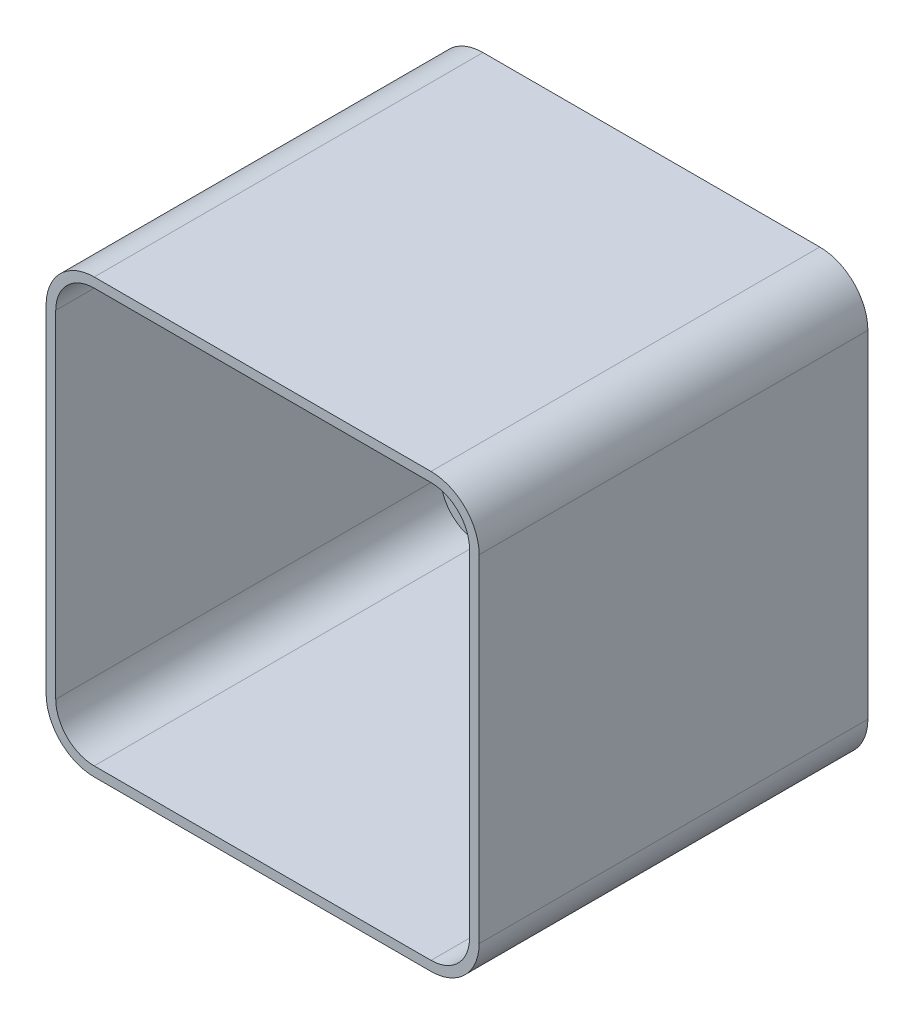
ISO-10303-21;
HEADER;
FILE_DESCRIPTION(('STEP AP214'),'2;1');
FILE_NAME('part.step','',(''),(''),'','','');
FILE_SCHEMA(('AUTOMOTIVE_DESIGN { 1 0 10303 214 1 1 1 1 }'));
ENDSEC;
DATA;
#1=APPLICATION_CONTEXT('core data for automotive mechanical design processes');
#2=APPLICATION_PROTOCOL_DEFINITION('international standard','automotive_design',2000,#1);
#3=PRODUCT_CONTEXT('',#1,'mechanical');
#4=PRODUCT('Part','Part','',(#3));
#5=PRODUCT_RELATED_PRODUCT_CATEGORY('part','',(#4));
#6=PRODUCT_DEFINITION_FORMATION('','',#4);
#7=PRODUCT_DEFINITION_CONTEXT('part definition',#1,'design');
#8=PRODUCT_DEFINITION('design','',#6,#7);
#9=PRODUCT_DEFINITION_SHAPE('','',#8);
#10=(LENGTH_UNIT() NAMED_UNIT(*) SI_UNIT(.MILLI.,.METRE.));
#11=(NAMED_UNIT(*) PLANE_ANGLE_UNIT() SI_UNIT($,.RADIAN.));
#12=(NAMED_UNIT(*) SI_UNIT($,.STERADIAN.) SOLID_ANGLE_UNIT());
#13=UNCERTAINTY_MEASURE_WITH_UNIT(LENGTH_MEASURE(1.E-05),#10,'distance_accuracy_value','');
#14=(GEOMETRIC_REPRESENTATION_CONTEXT(3) GLOBAL_UNCERTAINTY_ASSIGNED_CONTEXT((#13)) GLOBAL_UNIT_ASSIGNED_CONTEXT((#10,
#11,#12)) REPRESENTATION_CONTEXT('',''));
#15=CARTESIAN_POINT('',(0.,0.,0.));
#16=DIRECTION('',(0.,0.,1.));
#17=DIRECTION('',(1.,0.,0.));
#18=AXIS2_PLACEMENT_3D('',#15,#16,#17);
#19=CARTESIAN_POINT('',(175.,175.,4.));
#20=DIRECTION('',(0.,0.,-1.));
#21=DIRECTION('',(-1.,0.,0.));
#22=AXIS2_PLACEMENT_3D('',#19,#20,#21);
#23=CYLINDRICAL_SURFACE('',#22,50.);
#24=CARTESIAN_POINT('',(175.,175.,0.));
#25=DIRECTION('',(0.,0.,1.));
#26=DIRECTION('',(-1.,0.,0.));
#27=AXIS2_PLACEMENT_3D('',#24,#25,#26);
#28=CIRCLE('',#27,50.);
#29=CARTESIAN_POINT('',(225.,175.,0.));
#30=VERTEX_POINT('',#29);
#31=CARTESIAN_POINT('',(175.,225.,0.));
#32=VERTEX_POINT('',#31);
#33=EDGE_CURVE('E239',#30,#32,#28,.T.);
#34=ORIENTED_EDGE('',*,*,#33,.T.);
#35=DIRECTION('',(0.,0.,-1.));
#36=VECTOR('',#35,1.);
#37=CARTESIAN_POINT('',(175.,225.,4.));
#38=LINE('',#37,#36);
#39=CARTESIAN_POINT('',(175.,225.,404.));
#40=VERTEX_POINT('',#39);
#41=EDGE_CURVE('E11',#40,#32,#38,.T.);
#42=ORIENTED_EDGE('',*,*,#41,.F.);
#43=CARTESIAN_POINT('',(175.,175.,404.));
#44=DIRECTION('',(0.,0.,1.));
#45=DIRECTION('',(1.,0.,0.));
#46=AXIS2_PLACEMENT_3D('',#43,#44,#45);
#47=CIRCLE('',#46,50.);
#48=CARTESIAN_POINT('',(225.,175.,404.));
#49=VERTEX_POINT('',#48);
#50=EDGE_CURVE('E163',#49,#40,#47,.T.);
#51=ORIENTED_EDGE('',*,*,#50,.F.);
#52=DIRECTION('',(0.,0.,-1.));
#53=VECTOR('',#52,1.);
#54=CARTESIAN_POINT('',(225.,175.,4.));
#55=LINE('',#54,#53);
#56=EDGE_CURVE('E255',#49,#30,#55,.T.);
#57=ORIENTED_EDGE('',*,*,#56,.T.);
#58=EDGE_LOOP('',(#34,#42,#51,#57));
#59=FACE_BOUND('',#58,.T.);
#60=ADVANCED_FACE('F33',(#59),#23,.T.);
#61=CARTESIAN_POINT('',(-175.,225.,4.));
#62=DIRECTION('',(0.,-1.,0.));
#63=DIRECTION('',(0.,0.,-1.));
#64=AXIS2_PLACEMENT_3D('',#61,#62,#63);
#65=PLANE('',#64);
#66=DIRECTION('',(-1.,0.,0.));
#67=VECTOR('',#66,1.);
#68=CARTESIAN_POINT('',(-175.,225.,0.));
#69=LINE('',#68,#67);
#70=CARTESIAN_POINT('',(-175.,225.,0.));
#71=VERTEX_POINT('',#70);
#72=EDGE_CURVE('E242',#32,#71,#69,.T.);
#73=ORIENTED_EDGE('',*,*,#72,.T.);
#74=DIRECTION('',(0.,0.,-1.));
#75=VECTOR('',#74,1.);
#76=CARTESIAN_POINT('',(-175.,225.,4.));
#77=LINE('',#76,#75);
#78=CARTESIAN_POINT('',(-175.,225.,404.));
#79=VERTEX_POINT('',#78);
#80=EDGE_CURVE('E40',#79,#71,#77,.T.);
#81=ORIENTED_EDGE('',*,*,#80,.F.);
#82=DIRECTION('',(-1.,0.,0.));
#83=VECTOR('',#82,1.);
#84=CARTESIAN_POINT('',(175.,225.,404.));
#85=LINE('',#84,#83);
#86=EDGE_CURVE('E218',#40,#79,#85,.T.);
#87=ORIENTED_EDGE('',*,*,#86,.F.);
#88=ORIENTED_EDGE('',*,*,#41,.T.);
#89=EDGE_LOOP('',(#73,#81,#87,#88));
#90=FACE_BOUND('',#89,.T.);
#91=ADVANCED_FACE('F301',(#90),#65,.F.);
#92=CARTESIAN_POINT('',(-175.,175.,4.));
#93=DIRECTION('',(0.,0.,-1.));
#94=DIRECTION('',(-1.,0.,0.));
#95=AXIS2_PLACEMENT_3D('',#92,#93,#94);
#96=CYLINDRICAL_SURFACE('',#95,50.);
#97=CARTESIAN_POINT('',(-175.,175.,0.));
#98=DIRECTION('',(0.,0.,1.));
#99=DIRECTION('',(1.,0.,0.));
#100=AXIS2_PLACEMENT_3D('',#97,#98,#99);
#101=CIRCLE('',#100,50.);
#102=CARTESIAN_POINT('',(-225.,175.,0.));
#103=VERTEX_POINT('',#102);
#104=EDGE_CURVE('E244',#71,#103,#101,.T.);
#105=ORIENTED_EDGE('',*,*,#104,.T.);
#106=DIRECTION('',(0.,0.,-1.));
#107=VECTOR('',#106,1.);
#108=CARTESIAN_POINT('',(-225.,175.,4.));
#109=LINE('',#108,#107);
#110=CARTESIAN_POINT('',(-225.,175.,404.));
#111=VERTEX_POINT('',#110);
#112=EDGE_CURVE('E268',#111,#103,#109,.T.);
#113=ORIENTED_EDGE('',*,*,#112,.F.);
#114=CARTESIAN_POINT('',(-175.,175.,404.));
#115=DIRECTION('',(0.,0.,1.));
#116=DIRECTION('',(1.,0.,0.));
#117=AXIS2_PLACEMENT_3D('',#114,#115,#116);
#118=CIRCLE('',#117,50.);
#119=EDGE_CURVE('E221',#79,#111,#118,.T.);
#120=ORIENTED_EDGE('',*,*,#119,.F.);
#121=ORIENTED_EDGE('',*,*,#80,.T.);
#122=EDGE_LOOP('',(#105,#113,#120,#121));
#123=FACE_BOUND('',#122,.T.);
#124=ADVANCED_FACE('F274',(#123),#96,.T.);
#125=CARTESIAN_POINT('',(-225.,175.,4.));
#126=DIRECTION('',(1.,0.,0.));
#127=DIRECTION('',(0.,0.,-1.));
#128=AXIS2_PLACEMENT_3D('',#125,#126,#127);
#129=PLANE('',#128);
#130=DIRECTION('',(0.,-1.,0.));
#131=VECTOR('',#130,1.);
#132=CARTESIAN_POINT('',(-225.,175.,0.));
#133=LINE('',#132,#131);
#134=CARTESIAN_POINT('',(-225.,-175.,0.));
#135=VERTEX_POINT('',#134);
#136=EDGE_CURVE('E246',#103,#135,#133,.T.);
#137=ORIENTED_EDGE('',*,*,#136,.T.);
#138=DIRECTION('',(0.,0.,-1.));
#139=VECTOR('',#138,1.);
#140=CARTESIAN_POINT('',(-225.,-175.,4.));
#141=LINE('',#140,#139);
#142=CARTESIAN_POINT('',(-225.,-175.,404.));
#143=VERTEX_POINT('',#142);
#144=EDGE_CURVE('E265',#143,#135,#141,.T.);
#145=ORIENTED_EDGE('',*,*,#144,.F.);
#146=DIRECTION('',(0.,-1.,0.));
#147=VECTOR('',#146,1.);
#148=CARTESIAN_POINT('',(-225.,175.,404.));
#149=LINE('',#148,#147);
#150=EDGE_CURVE('E224',#111,#143,#149,.T.);
#151=ORIENTED_EDGE('',*,*,#150,.F.);
#152=ORIENTED_EDGE('',*,*,#112,.T.);
#153=EDGE_LOOP('',(#137,#145,#151,#152));
#154=FACE_BOUND('',#153,.T.);
#155=ADVANCED_FACE('F284',(#154),#129,.F.);
#156=CARTESIAN_POINT('',(-175.,-175.,4.));
#157=DIRECTION('',(0.,0.,-1.));
#158=DIRECTION('',(-1.,0.,0.));
#159=AXIS2_PLACEMENT_3D('',#156,#157,#158);
#160=CYLINDRICAL_SURFACE('',#159,50.);
#161=CARTESIAN_POINT('',(-175.,-175.,0.));
#162=DIRECTION('',(0.,0.,1.));
#163=DIRECTION('',(1.,0.,0.));
#164=AXIS2_PLACEMENT_3D('',#161,#162,#163);
#165=CIRCLE('',#164,50.);
#166=CARTESIAN_POINT('',(-175.,-225.,0.));
#167=VERTEX_POINT('',#166);
#168=EDGE_CURVE('E248',#135,#167,#165,.T.);
#169=ORIENTED_EDGE('',*,*,#168,.T.);
#170=DIRECTION('',(0.,0.,-1.));
#171=VECTOR('',#170,1.);
#172=CARTESIAN_POINT('',(-175.,-225.,4.));
#173=LINE('',#172,#171);
#174=CARTESIAN_POINT('',(-175.,-225.,404.));
#175=VERTEX_POINT('',#174);
#176=EDGE_CURVE('E262',#175,#167,#173,.T.);
#177=ORIENTED_EDGE('',*,*,#176,.F.);
#178=CARTESIAN_POINT('',(-175.,-175.,404.));
#179=DIRECTION('',(0.,0.,1.));
#180=DIRECTION('',(1.,0.,0.));
#181=AXIS2_PLACEMENT_3D('',#178,#179,#180);
#182=CIRCLE('',#181,50.);
#183=EDGE_CURVE('E227',#143,#175,#182,.T.);
#184=ORIENTED_EDGE('',*,*,#183,.F.);
#185=ORIENTED_EDGE('',*,*,#144,.T.);
#186=EDGE_LOOP('',(#169,#177,#184,#185));
#187=FACE_BOUND('',#186,.T.);
#188=ADVANCED_FACE('F288',(#187),#160,.T.);
#189=CARTESIAN_POINT('',(-175.,-225.,4.));
#190=DIRECTION('',(0.,1.,0.));
#191=DIRECTION('',(0.,0.,1.));
#192=AXIS2_PLACEMENT_3D('',#189,#190,#191);
#193=PLANE('',#192);
#194=DIRECTION('',(1.,0.,0.));
#195=VECTOR('',#194,1.);
#196=CARTESIAN_POINT('',(-175.,-225.,0.));
#197=LINE('',#196,#195);
#198=CARTESIAN_POINT('',(175.,-225.,0.));
#199=VERTEX_POINT('',#198);
#200=EDGE_CURVE('E250',#167,#199,#197,.T.);
#201=ORIENTED_EDGE('',*,*,#200,.T.);
#202=DIRECTION('',(0.,0.,-1.));
#203=VECTOR('',#202,1.);
#204=CARTESIAN_POINT('',(175.,-225.,4.));
#205=LINE('',#204,#203);
#206=CARTESIAN_POINT('',(175.,-225.,404.));
#207=VERTEX_POINT('',#206);
#208=EDGE_CURVE('E259',#207,#199,#205,.T.);
#209=ORIENTED_EDGE('',*,*,#208,.F.);
#210=DIRECTION('',(1.,0.,0.));
#211=VECTOR('',#210,1.);
#212=CARTESIAN_POINT('',(-175.,-225.,404.));
#213=LINE('',#212,#211);
#214=EDGE_CURVE('E230',#175,#207,#213,.T.);
#215=ORIENTED_EDGE('',*,*,#214,.F.);
#216=ORIENTED_EDGE('',*,*,#176,.T.);
#217=EDGE_LOOP('',(#201,#209,#215,#216));
#218=FACE_BOUND('',#217,.T.);
#219=ADVANCED_FACE('F293',(#218),#193,.F.);
#220=CARTESIAN_POINT('',(175.,-175.,4.));
#221=DIRECTION('',(0.,0.,-1.));
#222=DIRECTION('',(-1.,0.,0.));
#223=AXIS2_PLACEMENT_3D('',#220,#221,#222);
#224=CYLINDRICAL_SURFACE('',#223,50.);
#225=CARTESIAN_POINT('',(175.,-175.,0.));
#226=DIRECTION('',(0.,0.,1.));
#227=DIRECTION('',(1.,0.,0.));
#228=AXIS2_PLACEMENT_3D('',#225,#226,#227);
#229=CIRCLE('',#228,50.);
#230=CARTESIAN_POINT('',(225.,-175.,0.));
#231=VERTEX_POINT('',#230);
#232=EDGE_CURVE('E252',#199,#231,#229,.T.);
#233=ORIENTED_EDGE('',*,*,#232,.T.);
#234=DIRECTION('',(0.,0.,-1.));
#235=VECTOR('',#234,1.);
#236=CARTESIAN_POINT('',(225.,-175.,4.));
#237=LINE('',#236,#235);
#238=CARTESIAN_POINT('',(225.,-175.,404.));
#239=VERTEX_POINT('',#238);
#240=EDGE_CURVE('E257',#239,#231,#237,.T.);
#241=ORIENTED_EDGE('',*,*,#240,.F.);
#242=CARTESIAN_POINT('',(175.,-175.,404.));
#243=DIRECTION('',(0.,0.,1.));
#244=DIRECTION('',(1.,0.,0.));
#245=AXIS2_PLACEMENT_3D('',#242,#243,#244);
#246=CIRCLE('',#245,50.);
#247=EDGE_CURVE('E233',#207,#239,#246,.T.);
#248=ORIENTED_EDGE('',*,*,#247,.F.);
#249=ORIENTED_EDGE('',*,*,#208,.T.);
#250=EDGE_LOOP('',(#233,#241,#248,#249));
#251=FACE_BOUND('',#250,.T.);
#252=ADVANCED_FACE('F296',(#251),#224,.T.);
#253=CARTESIAN_POINT('',(225.,175.,4.));
#254=DIRECTION('',(-1.,0.,0.));
#255=DIRECTION('',(0.,-1.,0.));
#256=AXIS2_PLACEMENT_3D('',#253,#254,#255);
#257=PLANE('',#256);
#258=DIRECTION('',(0.,1.,0.));
#259=VECTOR('',#258,1.);
#260=CARTESIAN_POINT('',(225.,175.,0.));
#261=LINE('',#260,#259);
#262=EDGE_CURVE('E55',#231,#30,#261,.T.);
#263=ORIENTED_EDGE('',*,*,#262,.T.);
#264=ORIENTED_EDGE('',*,*,#56,.F.);
#265=DIRECTION('',(0.,1.,0.));
#266=VECTOR('',#265,1.);
#267=CARTESIAN_POINT('',(225.,-175.,404.));
#268=LINE('',#267,#266);
#269=EDGE_CURVE('E236',#239,#49,#268,.T.);
#270=ORIENTED_EDGE('',*,*,#269,.F.);
#271=ORIENTED_EDGE('',*,*,#240,.T.);
#272=EDGE_LOOP('',(#263,#264,#270,#271));
#273=FACE_BOUND('',#272,.T.);
#274=ADVANCED_FACE('F300',(#273),#257,.F.);
#275=CARTESIAN_POINT('',(175.,175.,0.));
#276=DIRECTION('',(0.,0.,-1.));
#277=DIRECTION('',(-1.,0.,0.));
#278=AXIS2_PLACEMENT_3D('',#275,#276,#277);
#279=PLANE('',#278);
#280=ORIENTED_EDGE('',*,*,#33,.F.);
#281=ORIENTED_EDGE('',*,*,#262,.F.);
#282=ORIENTED_EDGE('',*,*,#232,.F.);
#283=ORIENTED_EDGE('',*,*,#200,.F.);
#284=ORIENTED_EDGE('',*,*,#168,.F.);
#285=ORIENTED_EDGE('',*,*,#136,.F.);
#286=ORIENTED_EDGE('',*,*,#104,.F.);
#287=ORIENTED_EDGE('',*,*,#72,.F.);
#288=EDGE_LOOP('',(#280,#281,#282,#283,#284,#285,#286,#287));
#289=FACE_BOUND('',#288,.T.);
#290=ADVANCED_FACE('F280',(#289),#279,.T.);
#291=CARTESIAN_POINT('',(175.,175.,404.));
#292=DIRECTION('',(0.,0.,1.));
#293=DIRECTION('',(1.,0.,0.));
#294=AXIS2_PLACEMENT_3D('',#291,#292,#293);
#295=PLANE('',#294);
#296=ORIENTED_EDGE('',*,*,#50,.T.);
#297=ORIENTED_EDGE('',*,*,#86,.T.);
#298=ORIENTED_EDGE('',*,*,#119,.T.);
#299=ORIENTED_EDGE('',*,*,#150,.T.);
#300=ORIENTED_EDGE('',*,*,#183,.T.);
#301=ORIENTED_EDGE('',*,*,#214,.T.);
#302=ORIENTED_EDGE('',*,*,#247,.T.);
#303=ORIENTED_EDGE('',*,*,#269,.T.);
#304=EDGE_LOOP('',(#296,#297,#298,#299,#300,#301,#302,#303));
#305=FACE_BOUND('',#304,.T.);
#306=DIRECTION('',(0.,-1.,0.));
#307=VECTOR('',#306,1.);
#308=CARTESIAN_POINT('',(-215.,175.,404.));
#309=LINE('',#308,#307);
#310=CARTESIAN_POINT('',(-215.,175.,404.));
#311=VERTEX_POINT('',#310);
#312=CARTESIAN_POINT('',(-215.,-175.,404.));
#313=VERTEX_POINT('',#312);
#314=EDGE_CURVE('E155',#311,#313,#309,.T.);
#315=ORIENTED_EDGE('',*,*,#314,.F.);
#316=CARTESIAN_POINT('',(-175.,175.,404.));
#317=DIRECTION('',(0.,0.,1.));
#318=DIRECTION('',(1.,0.,0.));
#319=AXIS2_PLACEMENT_3D('',#316,#317,#318);
#320=CIRCLE('',#319,40.);
#321=CARTESIAN_POINT('',(-175.,215.,404.));
#322=VERTEX_POINT('',#321);
#323=EDGE_CURVE('E147',#322,#311,#320,.T.);
#324=ORIENTED_EDGE('',*,*,#323,.F.);
#325=DIRECTION('',(-1.,0.,0.));
#326=VECTOR('',#325,1.);
#327=CARTESIAN_POINT('',(175.,215.,404.));
#328=LINE('',#327,#326);
#329=CARTESIAN_POINT('',(175.,215.,404.));
#330=VERTEX_POINT('',#329);
#331=EDGE_CURVE('E182',#330,#322,#328,.T.);
#332=ORIENTED_EDGE('',*,*,#331,.F.);
#333=CARTESIAN_POINT('',(175.,175.,404.));
#334=DIRECTION('',(0.,0.,1.));
#335=DIRECTION('',(1.,0.,0.));
#336=AXIS2_PLACEMENT_3D('',#333,#334,#335);
#337=CIRCLE('',#336,40.);
#338=CARTESIAN_POINT('',(215.,175.,404.));
#339=VERTEX_POINT('',#338);
#340=EDGE_CURVE('E179',#339,#330,#337,.T.);
#341=ORIENTED_EDGE('',*,*,#340,.F.);
#342=DIRECTION('',(0.,1.,0.));
#343=VECTOR('',#342,1.);
#344=CARTESIAN_POINT('',(215.,-175.,404.));
#345=LINE('',#344,#343);
#346=CARTESIAN_POINT('',(215.,-175.,404.));
#347=VERTEX_POINT('',#346);
#348=EDGE_CURVE('E177',#347,#339,#345,.T.);
#349=ORIENTED_EDGE('',*,*,#348,.F.);
#350=CARTESIAN_POINT('',(175.,-175.,404.));
#351=DIRECTION('',(0.,0.,1.));
#352=DIRECTION('',(1.,0.,0.));
#353=AXIS2_PLACEMENT_3D('',#350,#351,#352);
#354=CIRCLE('',#353,40.);
#355=CARTESIAN_POINT('',(175.,-215.,404.));
#356=VERTEX_POINT('',#355);
#357=EDGE_CURVE('E175',#356,#347,#354,.T.);
#358=ORIENTED_EDGE('',*,*,#357,.F.);
#359=DIRECTION('',(1.,0.,0.));
#360=VECTOR('',#359,1.);
#361=CARTESIAN_POINT('',(-175.,-215.,404.));
#362=LINE('',#361,#360);
#363=CARTESIAN_POINT('',(-175.,-215.,404.));
#364=VERTEX_POINT('',#363);
#365=EDGE_CURVE('E171',#364,#356,#362,.T.);
#366=ORIENTED_EDGE('',*,*,#365,.F.);
#367=CARTESIAN_POINT('',(-175.,-175.,404.));
#368=DIRECTION('',(0.,0.,1.));
#369=DIRECTION('',(1.,0.,0.));
#370=AXIS2_PLACEMENT_3D('',#367,#368,#369);
#371=CIRCLE('',#370,40.);
#372=EDGE_CURVE('E169',#313,#364,#371,.T.);
#373=ORIENTED_EDGE('',*,*,#372,.F.);
#374=EDGE_LOOP('',(#315,#324,#332,#341,#349,#358,#366,#373));
#375=FACE_BOUND('',#374,.T.);
#376=ADVANCED_FACE('F167',(#305,#375),#295,.T.);
#377=CARTESIAN_POINT('',(-175.,175.,404.));
#378=DIRECTION('',(0.,0.,-1.));
#379=DIRECTION('',(-1.,0.,0.));
#380=AXIS2_PLACEMENT_3D('',#377,#378,#379);
#381=CYLINDRICAL_SURFACE('',#380,40.);
#382=CARTESIAN_POINT('',(-175.,175.,4.));
#383=DIRECTION('',(0.,0.,1.));
#384=DIRECTION('',(1.,0.,0.));
#385=AXIS2_PLACEMENT_3D('',#382,#383,#384);
#386=CIRCLE('',#385,40.);
#387=CARTESIAN_POINT('',(-175.,215.,4.));
#388=VERTEX_POINT('',#387);
#389=CARTESIAN_POINT('',(-215.,175.,4.));
#390=VERTEX_POINT('',#389);
#391=EDGE_CURVE('E184',#388,#390,#386,.T.);
#392=ORIENTED_EDGE('',*,*,#391,.F.);
#393=DIRECTION('',(0.,0.,-1.));
#394=VECTOR('',#393,1.);
#395=CARTESIAN_POINT('',(-175.,215.,404.));
#396=LINE('',#395,#394);
#397=EDGE_CURVE('E47',#322,#388,#396,.T.);
#398=ORIENTED_EDGE('',*,*,#397,.F.);
#399=ORIENTED_EDGE('',*,*,#323,.T.);
#400=DIRECTION('',(0.,0.,-1.));
#401=VECTOR('',#400,1.);
#402=CARTESIAN_POINT('',(-215.,175.,404.));
#403=LINE('',#402,#401);
#404=EDGE_CURVE('E150',#311,#390,#403,.T.);
#405=ORIENTED_EDGE('',*,*,#404,.T.);
#406=EDGE_LOOP('',(#392,#398,#399,#405));
#407=FACE_BOUND('',#406,.T.);
#408=ADVANCED_FACE('F149',(#407),#381,.F.);
#409=CARTESIAN_POINT('',(-215.,175.,404.));
#410=DIRECTION('',(1.,0.,0.));
#411=DIRECTION('',(0.,1.,0.));
#412=AXIS2_PLACEMENT_3D('',#409,#410,#411);
#413=PLANE('',#412);
#414=DIRECTION('',(0.,-1.,0.));
#415=VECTOR('',#414,1.);
#416=CARTESIAN_POINT('',(-215.,175.,4.));
#417=LINE('',#416,#415);
#418=CARTESIAN_POINT('',(-215.,-175.,4.));
#419=VERTEX_POINT('',#418);
#420=EDGE_CURVE('E162',#390,#419,#417,.T.);
#421=ORIENTED_EDGE('',*,*,#420,.F.);
#422=ORIENTED_EDGE('',*,*,#404,.F.);
#423=ORIENTED_EDGE('',*,*,#314,.T.);
#424=DIRECTION('',(0.,0.,-1.));
#425=VECTOR('',#424,1.);
#426=CARTESIAN_POINT('',(-215.,-175.,404.));
#427=LINE('',#426,#425);
#428=EDGE_CURVE('E164',#313,#419,#427,.T.);
#429=ORIENTED_EDGE('',*,*,#428,.T.);
#430=EDGE_LOOP('',(#421,#422,#423,#429));
#431=FACE_BOUND('',#430,.T.);
#432=ADVANCED_FACE('F159',(#431),#413,.T.);
#433=CARTESIAN_POINT('',(-175.,-175.,404.));
#434=DIRECTION('',(0.,0.,-1.));
#435=DIRECTION('',(-1.,0.,0.));
#436=AXIS2_PLACEMENT_3D('',#433,#434,#435);
#437=CYLINDRICAL_SURFACE('',#436,40.);
#438=CARTESIAN_POINT('',(-175.,-175.,4.));
#439=DIRECTION('',(0.,0.,1.));
#440=DIRECTION('',(1.,0.,0.));
#441=AXIS2_PLACEMENT_3D('',#438,#439,#440);
#442=CIRCLE('',#441,40.);
#443=CARTESIAN_POINT('',(-175.,-215.,4.));
#444=VERTEX_POINT('',#443);
#445=EDGE_CURVE('E187',#419,#444,#442,.T.);
#446=ORIENTED_EDGE('',*,*,#445,.F.);
#447=ORIENTED_EDGE('',*,*,#428,.F.);
#448=ORIENTED_EDGE('',*,*,#372,.T.);
#449=DIRECTION('',(0.,0.,-1.));
#450=VECTOR('',#449,1.);
#451=CARTESIAN_POINT('',(-175.,-215.,404.));
#452=LINE('',#451,#450);
#453=EDGE_CURVE('E213',#364,#444,#452,.T.);
#454=ORIENTED_EDGE('',*,*,#453,.T.);
#455=EDGE_LOOP('',(#446,#447,#448,#454));
#456=FACE_BOUND('',#455,.T.);
#457=ADVANCED_FACE('F332',(#456),#437,.F.);
#458=CARTESIAN_POINT('',(-175.,-215.,404.));
#459=DIRECTION('',(0.,1.,0.));
#460=DIRECTION('',(-1.,0.,0.));
#461=AXIS2_PLACEMENT_3D('',#458,#459,#460);
#462=PLANE('',#461);
#463=DIRECTION('',(1.,0.,0.));
#464=VECTOR('',#463,1.);
#465=CARTESIAN_POINT('',(-175.,-215.,4.));
#466=LINE('',#465,#464);
#467=CARTESIAN_POINT('',(175.,-215.,4.));
#468=VERTEX_POINT('',#467);
#469=EDGE_CURVE('E190',#444,#468,#466,.T.);
#470=ORIENTED_EDGE('',*,*,#469,.F.);
#471=ORIENTED_EDGE('',*,*,#453,.F.);
#472=ORIENTED_EDGE('',*,*,#365,.T.);
#473=DIRECTION('',(0.,0.,-1.));
#474=VECTOR('',#473,1.);
#475=CARTESIAN_POINT('',(175.,-215.,404.));
#476=LINE('',#475,#474);
#477=EDGE_CURVE('E211',#356,#468,#476,.T.);
#478=ORIENTED_EDGE('',*,*,#477,.T.);
#479=EDGE_LOOP('',(#470,#471,#472,#478));
#480=FACE_BOUND('',#479,.T.);
#481=ADVANCED_FACE('F335',(#480),#462,.T.);
#482=CARTESIAN_POINT('',(175.,-175.,404.));
#483=DIRECTION('',(0.,0.,-1.));
#484=DIRECTION('',(-1.,0.,0.));
#485=AXIS2_PLACEMENT_3D('',#482,#483,#484);
#486=CYLINDRICAL_SURFACE('',#485,40.);
#487=CARTESIAN_POINT('',(175.,-175.,4.));
#488=DIRECTION('',(0.,0.,1.));
#489=DIRECTION('',(1.,0.,0.));
#490=AXIS2_PLACEMENT_3D('',#487,#488,#489);
#491=CIRCLE('',#490,40.);
#492=CARTESIAN_POINT('',(215.,-175.,4.));
#493=VERTEX_POINT('',#492);
#494=EDGE_CURVE('E193',#468,#493,#491,.T.);
#495=ORIENTED_EDGE('',*,*,#494,.F.);
#496=ORIENTED_EDGE('',*,*,#477,.F.);
#497=ORIENTED_EDGE('',*,*,#357,.T.);
#498=DIRECTION('',(0.,0.,-1.));
#499=VECTOR('',#498,1.);
#500=CARTESIAN_POINT('',(215.,-175.,404.));
#501=LINE('',#500,#499);
#502=EDGE_CURVE('E209',#347,#493,#501,.T.);
#503=ORIENTED_EDGE('',*,*,#502,.T.);
#504=EDGE_LOOP('',(#495,#496,#497,#503));
#505=FACE_BOUND('',#504,.T.);
#506=ADVANCED_FACE('F339',(#505),#486,.F.);
#507=CARTESIAN_POINT('',(215.,-175.,404.));
#508=DIRECTION('',(-1.,0.,0.));
#509=DIRECTION('',(0.,-1.,0.));
#510=AXIS2_PLACEMENT_3D('',#507,#508,#509);
#511=PLANE('',#510);
#512=DIRECTION('',(0.,1.,0.));
#513=VECTOR('',#512,1.);
#514=CARTESIAN_POINT('',(215.,-175.,4.));
#515=LINE('',#514,#513);
#516=CARTESIAN_POINT('',(215.,175.,4.));
#517=VERTEX_POINT('',#516);
#518=EDGE_CURVE('E196',#493,#517,#515,.T.);
#519=ORIENTED_EDGE('',*,*,#518,.F.);
#520=ORIENTED_EDGE('',*,*,#502,.F.);
#521=ORIENTED_EDGE('',*,*,#348,.T.);
#522=DIRECTION('',(0.,0.,-1.));
#523=VECTOR('',#522,1.);
#524=CARTESIAN_POINT('',(215.,175.,404.));
#525=LINE('',#524,#523);
#526=EDGE_CURVE('E207',#339,#517,#525,.T.);
#527=ORIENTED_EDGE('',*,*,#526,.T.);
#528=EDGE_LOOP('',(#519,#520,#521,#527));
#529=FACE_BOUND('',#528,.T.);
#530=ADVANCED_FACE('F343',(#529),#511,.T.);
#531=CARTESIAN_POINT('',(175.,175.,404.));
#532=DIRECTION('',(0.,0.,-1.));
#533=DIRECTION('',(-1.,0.,0.));
#534=AXIS2_PLACEMENT_3D('',#531,#532,#533);
#535=CYLINDRICAL_SURFACE('',#534,40.);
#536=CARTESIAN_POINT('',(175.,175.,4.));
#537=DIRECTION('',(0.,0.,1.));
#538=DIRECTION('',(1.,0.,0.));
#539=AXIS2_PLACEMENT_3D('',#536,#537,#538);
#540=CIRCLE('',#539,40.);
#541=CARTESIAN_POINT('',(175.,215.,4.));
#542=VERTEX_POINT('',#541);
#543=EDGE_CURVE('E199',#517,#542,#540,.T.);
#544=ORIENTED_EDGE('',*,*,#543,.F.);
#545=ORIENTED_EDGE('',*,*,#526,.F.);
#546=ORIENTED_EDGE('',*,*,#340,.T.);
#547=DIRECTION('',(0.,0.,-1.));
#548=VECTOR('',#547,1.);
#549=CARTESIAN_POINT('',(175.,215.,404.));
#550=LINE('',#549,#548);
#551=EDGE_CURVE('E205',#330,#542,#550,.T.);
#552=ORIENTED_EDGE('',*,*,#551,.T.);
#553=EDGE_LOOP('',(#544,#545,#546,#552));
#554=FACE_BOUND('',#553,.T.);
#555=ADVANCED_FACE('F347',(#554),#535,.F.);
#556=CARTESIAN_POINT('',(175.,215.,404.));
#557=DIRECTION('',(0.,-1.,0.));
#558=DIRECTION('',(1.,0.,0.));
#559=AXIS2_PLACEMENT_3D('',#556,#557,#558);
#560=PLANE('',#559);
#561=DIRECTION('',(-1.,0.,0.));
#562=VECTOR('',#561,1.);
#563=CARTESIAN_POINT('',(175.,215.,4.));
#564=LINE('',#563,#562);
#565=EDGE_CURVE('E156',#542,#388,#564,.T.);
#566=ORIENTED_EDGE('',*,*,#565,.F.);
#567=ORIENTED_EDGE('',*,*,#551,.F.);
#568=ORIENTED_EDGE('',*,*,#331,.T.);
#569=ORIENTED_EDGE('',*,*,#397,.T.);
#570=EDGE_LOOP('',(#566,#567,#568,#569));
#571=FACE_BOUND('',#570,.T.);
#572=ADVANCED_FACE('F324',(#571),#560,.T.);
#573=CARTESIAN_POINT('',(175.,175.,4.));
#574=DIRECTION('',(0.,0.,-1.));
#575=DIRECTION('',(-1.,0.,0.));
#576=AXIS2_PLACEMENT_3D('',#573,#574,#575);
#577=PLANE('',#576);
#578=ORIENTED_EDGE('',*,*,#565,.T.);
#579=ORIENTED_EDGE('',*,*,#391,.T.);
#580=ORIENTED_EDGE('',*,*,#420,.T.);
#581=ORIENTED_EDGE('',*,*,#445,.T.);
#582=ORIENTED_EDGE('',*,*,#469,.T.);
#583=ORIENTED_EDGE('',*,*,#494,.T.);
#584=ORIENTED_EDGE('',*,*,#518,.T.);
#585=ORIENTED_EDGE('',*,*,#543,.T.);
#586=EDGE_LOOP('',(#578,#579,#580,#581,#582,#583,#584,#585));
#587=FACE_BOUND('',#586,.T.);
#588=ADVANCED_FACE('F321',(#587),#577,.F.);
#589=CLOSED_SHELL('',(#60,#91,#124,#155,#188,#219,#252,#274,#290,#376,#408,#432,#457,#481,#506,
#530,#555,#572,#588));
#590=MANIFOLD_SOLID_BREP('B2',#589);
#591=ADVANCED_BREP_SHAPE_REPRESENTATION('',(#18,#590),#14);
#592=SHAPE_DEFINITION_REPRESENTATION(#9,#591);
ENDSEC;
END-ISO-10303-21;
